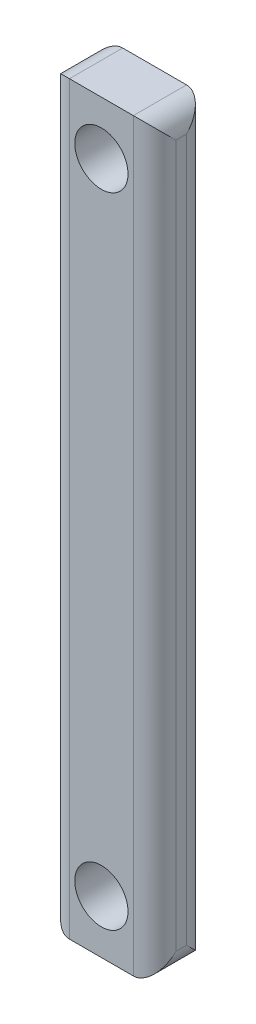
ISO-10303-21;
HEADER;
FILE_DESCRIPTION(('STEP AP214'),'2;1');
FILE_NAME('part.step','',(''),(''),'','','');
FILE_SCHEMA(('AUTOMOTIVE_DESIGN { 1 0 10303 214 1 1 1 1 }'));
ENDSEC;
DATA;
#1=APPLICATION_CONTEXT('core data for automotive mechanical design processes');
#2=APPLICATION_PROTOCOL_DEFINITION('international standard','automotive_design',2000,#1);
#3=PRODUCT_CONTEXT('',#1,'mechanical');
#4=PRODUCT('Part','Part','',(#3));
#5=PRODUCT_RELATED_PRODUCT_CATEGORY('part','',(#4));
#6=PRODUCT_DEFINITION_FORMATION('','',#4);
#7=PRODUCT_DEFINITION_CONTEXT('part definition',#1,'design');
#8=PRODUCT_DEFINITION('design','',#6,#7);
#9=PRODUCT_DEFINITION_SHAPE('','',#8);
#10=(LENGTH_UNIT() NAMED_UNIT(*) SI_UNIT(.MILLI.,.METRE.));
#11=(NAMED_UNIT(*) PLANE_ANGLE_UNIT() SI_UNIT($,.RADIAN.));
#12=(NAMED_UNIT(*) SI_UNIT($,.STERADIAN.) SOLID_ANGLE_UNIT());
#13=UNCERTAINTY_MEASURE_WITH_UNIT(LENGTH_MEASURE(1.E-05),#10,'distance_accuracy_value','');
#14=(GEOMETRIC_REPRESENTATION_CONTEXT(3) GLOBAL_UNCERTAINTY_ASSIGNED_CONTEXT((#13)) GLOBAL_UNIT_ASSIGNED_CONTEXT((#10,
#11,#12)) REPRESENTATION_CONTEXT('',''));
#15=CARTESIAN_POINT('',(0.,0.,0.));
#16=DIRECTION('',(0.,0.,1.));
#17=DIRECTION('',(1.,0.,0.));
#18=AXIS2_PLACEMENT_3D('',#15,#16,#17);
#19=CARTESIAN_POINT('',(0.,0.,25.));
#20=DIRECTION('',(0.,0.,1.));
#21=DIRECTION('',(1.,0.,0.));
#22=AXIS2_PLACEMENT_3D('',#19,#20,#21);
#23=PLANE('',#22);
#24=CARTESIAN_POINT('',(-25.,25.,25.));
#25=DIRECTION('',(0.,0.,1.));
#26=DIRECTION('',(1.,0.,0.));
#27=AXIS2_PLACEMENT_3D('',#24,#25,#26);
#28=CIRCLE('',#27,12.5);
#29=CARTESIAN_POINT('',(-12.5,25.,25.));
#30=VERTEX_POINT('',#29);
#31=EDGE_CURVE('E237',#30,#30,#28,.T.);
#32=ORIENTED_EDGE('',*,*,#31,.F.);
#33=EDGE_LOOP('',(#32));
#34=FACE_BOUND('',#33,.T.);
#35=DIRECTION('',(-1.,0.,0.));
#36=VECTOR('',#35,1.);
#37=CARTESIAN_POINT('',(0.,350.,25.));
#38=LINE('',#37,#36);
#39=CARTESIAN_POINT('',(-10.,350.,25.));
#40=VERTEX_POINT('',#39);
#41=CARTESIAN_POINT('',(-40.,350.,25.));
#42=VERTEX_POINT('',#41);
#43=EDGE_CURVE('E185',#40,#42,#38,.T.);
#44=ORIENTED_EDGE('',*,*,#43,.T.);
#45=DIRECTION('',(0.,-1.,0.));
#46=VECTOR('',#45,1.);
#47=CARTESIAN_POINT('',(-40.,0.,25.));
#48=LINE('',#47,#46);
#49=CARTESIAN_POINT('',(-40.,0.,25.));
#50=VERTEX_POINT('',#49);
#51=EDGE_CURVE('E56',#42,#50,#48,.T.);
#52=ORIENTED_EDGE('',*,*,#51,.T.);
#53=DIRECTION('',(1.,0.,0.));
#54=VECTOR('',#53,1.);
#55=CARTESIAN_POINT('',(0.,0.,25.));
#56=LINE('',#55,#54);
#57=CARTESIAN_POINT('',(-10.,0.,25.));
#58=VERTEX_POINT('',#57);
#59=EDGE_CURVE('E120',#50,#58,#56,.T.);
#60=ORIENTED_EDGE('',*,*,#59,.T.);
#61=DIRECTION('',(0.,1.,0.));
#62=VECTOR('',#61,1.);
#63=CARTESIAN_POINT('',(-10.,350.,25.));
#64=LINE('',#63,#62);
#65=EDGE_CURVE('E143',#58,#40,#64,.T.);
#66=ORIENTED_EDGE('',*,*,#65,.T.);
#67=EDGE_LOOP('',(#44,#52,#60,#66));
#68=FACE_BOUND('',#67,.T.);
#69=CARTESIAN_POINT('',(-25.,325.,25.));
#70=DIRECTION('',(0.,0.,1.));
#71=DIRECTION('',(1.,0.,0.));
#72=AXIS2_PLACEMENT_3D('',#69,#70,#71);
#73=CIRCLE('',#72,12.5);
#74=CARTESIAN_POINT('',(-12.5,325.,25.));
#75=VERTEX_POINT('',#74);
#76=EDGE_CURVE('E230',#75,#75,#73,.T.);
#77=ORIENTED_EDGE('',*,*,#76,.F.);
#78=EDGE_LOOP('',(#77));
#79=FACE_BOUND('',#78,.T.);
#80=ADVANCED_FACE('F32',(#34,#68,#79),#23,.T.);
#81=CARTESIAN_POINT('',(0.,0.,0.));
#82=DIRECTION('',(0.,0.,1.));
#83=DIRECTION('',(1.,0.,0.));
#84=AXIS2_PLACEMENT_3D('',#81,#82,#83);
#85=PLANE('',#84);
#86=CARTESIAN_POINT('',(-25.,25.,0.));
#87=DIRECTION('',(0.,0.,1.));
#88=DIRECTION('',(1.,0.,0.));
#89=AXIS2_PLACEMENT_3D('',#86,#87,#88);
#90=CIRCLE('',#89,12.5);
#91=CARTESIAN_POINT('',(-12.5,25.,0.));
#92=VERTEX_POINT('',#91);
#93=EDGE_CURVE('E234',#92,#92,#90,.T.);
#94=ORIENTED_EDGE('',*,*,#93,.T.);
#95=EDGE_LOOP('',(#94));
#96=FACE_BOUND('',#95,.T.);
#97=DIRECTION('',(-1.,0.,0.));
#98=VECTOR('',#97,1.);
#99=CARTESIAN_POINT('',(0.,350.,0.));
#100=LINE('',#99,#98);
#101=CARTESIAN_POINT('',(-10.,350.,0.));
#102=VERTEX_POINT('',#101);
#103=CARTESIAN_POINT('',(-40.,350.,0.));
#104=VERTEX_POINT('',#103);
#105=EDGE_CURVE('E186',#102,#104,#100,.T.);
#106=ORIENTED_EDGE('',*,*,#105,.F.);
#107=DIRECTION('',(0.,1.,0.));
#108=VECTOR('',#107,1.);
#109=CARTESIAN_POINT('',(-10.,0.,0.));
#110=LINE('',#109,#108);
#111=CARTESIAN_POINT('',(-10.,0.,0.));
#112=VERTEX_POINT('',#111);
#113=EDGE_CURVE('E107',#102,#112,#110,.F.);
#114=ORIENTED_EDGE('',*,*,#113,.T.);
#115=DIRECTION('',(1.,0.,0.));
#116=VECTOR('',#115,1.);
#117=CARTESIAN_POINT('',(0.,0.,0.));
#118=LINE('',#117,#116);
#119=CARTESIAN_POINT('',(-40.,0.,0.));
#120=VERTEX_POINT('',#119);
#121=EDGE_CURVE('E178',#120,#112,#118,.T.);
#122=ORIENTED_EDGE('',*,*,#121,.F.);
#123=DIRECTION('',(0.,-1.,0.));
#124=VECTOR('',#123,1.);
#125=CARTESIAN_POINT('',(-40.,0.,0.));
#126=LINE('',#125,#124);
#127=EDGE_CURVE('E127',#120,#104,#126,.F.);
#128=ORIENTED_EDGE('',*,*,#127,.T.);
#129=EDGE_LOOP('',(#106,#114,#122,#128));
#130=FACE_BOUND('',#129,.T.);
#131=CARTESIAN_POINT('',(-25.,325.,0.));
#132=DIRECTION('',(0.,0.,1.));
#133=DIRECTION('',(1.,0.,0.));
#134=AXIS2_PLACEMENT_3D('',#131,#132,#133);
#135=CIRCLE('',#134,12.5);
#136=CARTESIAN_POINT('',(-12.5,325.,0.));
#137=VERTEX_POINT('',#136);
#138=EDGE_CURVE('E155',#137,#137,#135,.T.);
#139=ORIENTED_EDGE('',*,*,#138,.T.);
#140=EDGE_LOOP('',(#139));
#141=FACE_BOUND('',#140,.T.);
#142=ADVANCED_FACE('F182',(#96,#130,#141),#85,.F.);
#143=CARTESIAN_POINT('',(0.,0.,25.));
#144=DIRECTION('',(-1.,0.,0.));
#145=DIRECTION('',(0.,0.,1.));
#146=AXIS2_PLACEMENT_3D('',#143,#144,#145);
#147=PLANE('',#146);
#148=DIRECTION('',(0.,1.,0.));
#149=VECTOR('',#148,1.);
#150=CARTESIAN_POINT('',(0.,0.,15.));
#151=LINE('',#150,#149);
#152=CARTESIAN_POINT('',(0.,340.,15.));
#153=VERTEX_POINT('',#152);
#154=CARTESIAN_POINT('',(0.,10.,15.));
#155=VERTEX_POINT('',#154);
#156=EDGE_CURVE('E119',#153,#155,#151,.F.);
#157=ORIENTED_EDGE('',*,*,#156,.T.);
#158=DIRECTION('',(0.,0.,-1.));
#159=VECTOR('',#158,1.);
#160=CARTESIAN_POINT('',(0.,10.,25.));
#161=LINE('',#160,#159);
#162=CARTESIAN_POINT('',(0.,10.,10.));
#163=VERTEX_POINT('',#162);
#164=EDGE_CURVE('E124',#155,#163,#161,.T.);
#165=ORIENTED_EDGE('',*,*,#164,.T.);
#166=DIRECTION('',(0.,1.,0.));
#167=VECTOR('',#166,1.);
#168=CARTESIAN_POINT('',(0.,0.,10.));
#169=LINE('',#168,#167);
#170=CARTESIAN_POINT('',(0.,340.,10.));
#171=VERTEX_POINT('',#170);
#172=EDGE_CURVE('E105',#163,#171,#169,.T.);
#173=ORIENTED_EDGE('',*,*,#172,.T.);
#174=DIRECTION('',(0.,0.,-1.));
#175=VECTOR('',#174,1.);
#176=CARTESIAN_POINT('',(0.,340.,25.));
#177=LINE('',#176,#175);
#178=EDGE_CURVE('E113',#171,#153,#177,.F.);
#179=ORIENTED_EDGE('',*,*,#178,.T.);
#180=EDGE_LOOP('',(#157,#165,#173,#179));
#181=FACE_BOUND('',#180,.T.);
#182=ADVANCED_FACE('F122',(#181),#147,.F.);
#183=CARTESIAN_POINT('',(0.,350.,25.));
#184=DIRECTION('',(0.,-1.,0.));
#185=DIRECTION('',(0.,0.,-1.));
#186=AXIS2_PLACEMENT_3D('',#183,#184,#185);
#187=PLANE('',#186);
#188=ORIENTED_EDGE('',*,*,#43,.F.);
#189=DIRECTION('',(0.,0.,-1.));
#190=VECTOR('',#189,1.);
#191=CARTESIAN_POINT('',(-10.,350.,25.));
#192=LINE('',#191,#190);
#193=EDGE_CURVE('E11',#40,#102,#192,.T.);
#194=ORIENTED_EDGE('',*,*,#193,.T.);
#195=ORIENTED_EDGE('',*,*,#105,.T.);
#196=DIRECTION('',(0.,0.,-1.));
#197=VECTOR('',#196,1.);
#198=CARTESIAN_POINT('',(-40.,350.,25.));
#199=LINE('',#198,#197);
#200=EDGE_CURVE('E41',#104,#42,#199,.F.);
#201=ORIENTED_EDGE('',*,*,#200,.T.);
#202=EDGE_LOOP('',(#188,#194,#195,#201));
#203=FACE_BOUND('',#202,.T.);
#204=ADVANCED_FACE('F194',(#203),#187,.F.);
#205=CARTESIAN_POINT('',(-50.,0.,25.));
#206=DIRECTION('',(1.,0.,0.));
#207=DIRECTION('',(0.,0.,-1.));
#208=AXIS2_PLACEMENT_3D('',#205,#206,#207);
#209=PLANE('',#208);
#210=DIRECTION('',(0.,-1.,0.));
#211=VECTOR('',#210,1.);
#212=CARTESIAN_POINT('',(-50.,0.,10.));
#213=LINE('',#212,#211);
#214=CARTESIAN_POINT('',(-50.,340.,10.));
#215=VERTEX_POINT('',#214);
#216=CARTESIAN_POINT('',(-50.,9.99999999999999,10.));
#217=VERTEX_POINT('',#216);
#218=EDGE_CURVE('E138',#215,#217,#213,.T.);
#219=ORIENTED_EDGE('',*,*,#218,.T.);
#220=DIRECTION('',(0.,0.,-1.));
#221=VECTOR('',#220,1.);
#222=CARTESIAN_POINT('',(-50.,9.99999999999999,25.));
#223=LINE('',#222,#221);
#224=CARTESIAN_POINT('',(-50.,9.99999999999999,15.));
#225=VERTEX_POINT('',#224);
#226=EDGE_CURVE('E141',#217,#225,#223,.F.);
#227=ORIENTED_EDGE('',*,*,#226,.T.);
#228=DIRECTION('',(0.,-1.,0.));
#229=VECTOR('',#228,1.);
#230=CARTESIAN_POINT('',(-50.,350.,15.));
#231=LINE('',#230,#229);
#232=CARTESIAN_POINT('',(-50.,340.,15.));
#233=VERTEX_POINT('',#232);
#234=EDGE_CURVE('E136',#225,#233,#231,.F.);
#235=ORIENTED_EDGE('',*,*,#234,.T.);
#236=DIRECTION('',(0.,0.,-1.));
#237=VECTOR('',#236,1.);
#238=CARTESIAN_POINT('',(-50.,340.,25.));
#239=LINE('',#238,#237);
#240=EDGE_CURVE('E134',#233,#215,#239,.T.);
#241=ORIENTED_EDGE('',*,*,#240,.T.);
#242=EDGE_LOOP('',(#219,#227,#235,#241));
#243=FACE_BOUND('',#242,.T.);
#244=ADVANCED_FACE('F192',(#243),#209,.F.);
#245=CARTESIAN_POINT('',(0.,0.,25.));
#246=DIRECTION('',(0.,1.,0.));
#247=DIRECTION('',(-1.,0.,0.));
#248=AXIS2_PLACEMENT_3D('',#245,#246,#247);
#249=PLANE('',#248);
#250=ORIENTED_EDGE('',*,*,#121,.T.);
#251=DIRECTION('',(0.,0.,-1.));
#252=VECTOR('',#251,1.);
#253=CARTESIAN_POINT('',(-10.,0.,25.));
#254=LINE('',#253,#252);
#255=EDGE_CURVE('E49',#112,#58,#254,.F.);
#256=ORIENTED_EDGE('',*,*,#255,.T.);
#257=ORIENTED_EDGE('',*,*,#59,.F.);
#258=DIRECTION('',(0.,0.,-1.));
#259=VECTOR('',#258,1.);
#260=CARTESIAN_POINT('',(-40.,0.,25.));
#261=LINE('',#260,#259);
#262=EDGE_CURVE('E146',#50,#120,#261,.T.);
#263=ORIENTED_EDGE('',*,*,#262,.T.);
#264=EDGE_LOOP('',(#250,#256,#257,#263));
#265=FACE_BOUND('',#264,.T.);
#266=ADVANCED_FACE('F177',(#265),#249,.F.);
#267=CARTESIAN_POINT('',(-25.,25.,25.));
#268=DIRECTION('',(0.,0.,-1.));
#269=DIRECTION('',(-1.,0.,0.));
#270=AXIS2_PLACEMENT_3D('',#267,#268,#269);
#271=CYLINDRICAL_SURFACE('',#270,12.5);
#272=ORIENTED_EDGE('',*,*,#31,.T.);
#273=EDGE_LOOP('',(#272));
#274=FACE_BOUND('',#273,.T.);
#275=ORIENTED_EDGE('',*,*,#93,.F.);
#276=EDGE_LOOP('',(#275));
#277=FACE_BOUND('',#276,.T.);
#278=ADVANCED_FACE('F200',(#274,#277),#271,.F.);
#279=CARTESIAN_POINT('',(-25.,325.,25.));
#280=DIRECTION('',(0.,0.,-1.));
#281=DIRECTION('',(-1.,0.,0.));
#282=AXIS2_PLACEMENT_3D('',#279,#280,#281);
#283=CYLINDRICAL_SURFACE('',#282,12.5);
#284=ORIENTED_EDGE('',*,*,#76,.T.);
#285=EDGE_LOOP('',(#284));
#286=FACE_BOUND('',#285,.T.);
#287=ORIENTED_EDGE('',*,*,#138,.F.);
#288=EDGE_LOOP('',(#287));
#289=FACE_BOUND('',#288,.T.);
#290=ADVANCED_FACE('F216',(#286,#289),#283,.F.);
#291=CARTESIAN_POINT('',(-10.,0.,15.));
#292=DIRECTION('',(0.,-1.,0.));
#293=DIRECTION('',(0.,0.,-1.));
#294=AXIS2_PLACEMENT_3D('',#291,#292,#293);
#295=CYLINDRICAL_SURFACE('',#294,10.);
#296=CARTESIAN_POINT('',(-10.,340.,15.));
#297=DIRECTION('',(0.,0.707106781186547,-0.707106781186547));
#298=DIRECTION('',(0.,-0.707106781186547,-0.707106781186547));
#299=AXIS2_PLACEMENT_3D('',#296,#297,#298);
#300=ELLIPSE('',#299,14.1421356237309,10.);
#301=EDGE_CURVE('E116',#40,#153,#300,.T.);
#302=ORIENTED_EDGE('',*,*,#301,.F.);
#303=ORIENTED_EDGE('',*,*,#65,.F.);
#304=CARTESIAN_POINT('',(-10.,10.,15.));
#305=DIRECTION('',(0.,-0.707106781186547,-0.707106781186547));
#306=DIRECTION('',(0.,0.707106781186547,-0.707106781186547));
#307=AXIS2_PLACEMENT_3D('',#304,#305,#306);
#308=ELLIPSE('',#307,14.1421356237309,10.);
#309=EDGE_CURVE('E152',#155,#58,#308,.T.);
#310=ORIENTED_EDGE('',*,*,#309,.F.);
#311=ORIENTED_EDGE('',*,*,#156,.F.);
#312=EDGE_LOOP('',(#302,#303,#310,#311));
#313=FACE_BOUND('',#312,.T.);
#314=ADVANCED_FACE('F219',(#313),#295,.T.);
#315=CARTESIAN_POINT('',(-10.,10.,25.));
#316=DIRECTION('',(0.,0.,-1.));
#317=DIRECTION('',(-1.,0.,0.));
#318=AXIS2_PLACEMENT_3D('',#315,#316,#317);
#319=CYLINDRICAL_SURFACE('',#318,10.);
#320=ORIENTED_EDGE('',*,*,#309,.T.);
#321=ORIENTED_EDGE('',*,*,#255,.F.);
#322=CARTESIAN_POINT('',(-10.,10.,10.));
#323=DIRECTION('',(0.,0.707106781186547,-0.707106781186547));
#324=DIRECTION('',(0.,-0.707106781186547,-0.707106781186547));
#325=AXIS2_PLACEMENT_3D('',#322,#323,#324);
#326=ELLIPSE('',#325,14.1421356237309,10.);
#327=EDGE_CURVE('E110',#163,#112,#326,.T.);
#328=ORIENTED_EDGE('',*,*,#327,.F.);
#329=ORIENTED_EDGE('',*,*,#164,.F.);
#330=EDGE_LOOP('',(#320,#321,#328,#329));
#331=FACE_BOUND('',#330,.T.);
#332=ADVANCED_FACE('F224',(#331),#319,.T.);
#333=CARTESIAN_POINT('',(-10.,340.,25.));
#334=DIRECTION('',(0.,0.,-1.));
#335=DIRECTION('',(-1.,0.,0.));
#336=AXIS2_PLACEMENT_3D('',#333,#334,#335);
#337=CYLINDRICAL_SURFACE('',#336,10.);
#338=ORIENTED_EDGE('',*,*,#301,.T.);
#339=ORIENTED_EDGE('',*,*,#178,.F.);
#340=CARTESIAN_POINT('',(-10.,340.,10.));
#341=DIRECTION('',(0.,-0.707106781186547,-0.707106781186547));
#342=DIRECTION('',(0.,0.707106781186547,-0.707106781186547));
#343=AXIS2_PLACEMENT_3D('',#340,#341,#342);
#344=ELLIPSE('',#343,14.1421356237309,10.);
#345=EDGE_CURVE('E101',#102,#171,#344,.T.);
#346=ORIENTED_EDGE('',*,*,#345,.F.);
#347=ORIENTED_EDGE('',*,*,#193,.F.);
#348=EDGE_LOOP('',(#338,#339,#346,#347));
#349=FACE_BOUND('',#348,.T.);
#350=ADVANCED_FACE('F114',(#349),#337,.T.);
#351=CARTESIAN_POINT('',(-10.,0.,10.));
#352=DIRECTION('',(0.,1.,0.));
#353=DIRECTION('',(0.,0.,1.));
#354=AXIS2_PLACEMENT_3D('',#351,#352,#353);
#355=CYLINDRICAL_SURFACE('',#354,10.);
#356=ORIENTED_EDGE('',*,*,#327,.T.);
#357=ORIENTED_EDGE('',*,*,#113,.F.);
#358=ORIENTED_EDGE('',*,*,#345,.T.);
#359=ORIENTED_EDGE('',*,*,#172,.F.);
#360=EDGE_LOOP('',(#356,#357,#358,#359));
#361=FACE_BOUND('',#360,.T.);
#362=ADVANCED_FACE('F103',(#361),#355,.T.);
#363=CARTESIAN_POINT('',(-40.,0.,15.));
#364=DIRECTION('',(0.,1.,0.));
#365=DIRECTION('',(0.,0.,1.));
#366=AXIS2_PLACEMENT_3D('',#363,#364,#365);
#367=CYLINDRICAL_SURFACE('',#366,10.);
#368=CARTESIAN_POINT('',(-40.,9.99999999999999,15.));
#369=DIRECTION('',(0.,-0.707106781186547,-0.707106781186547));
#370=DIRECTION('',(0.,0.707106781186547,-0.707106781186547));
#371=AXIS2_PLACEMENT_3D('',#368,#369,#370);
#372=ELLIPSE('',#371,14.1421356237309,10.);
#373=EDGE_CURVE('E159',#50,#225,#372,.T.);
#374=ORIENTED_EDGE('',*,*,#373,.F.);
#375=ORIENTED_EDGE('',*,*,#51,.F.);
#376=CARTESIAN_POINT('',(-40.,340.,15.));
#377=DIRECTION('',(0.,0.707106781186547,-0.707106781186547));
#378=DIRECTION('',(0.,-0.707106781186547,-0.707106781186547));
#379=AXIS2_PLACEMENT_3D('',#376,#377,#378);
#380=ELLIPSE('',#379,14.1421356237309,10.);
#381=EDGE_CURVE('E36',#233,#42,#380,.T.);
#382=ORIENTED_EDGE('',*,*,#381,.F.);
#383=ORIENTED_EDGE('',*,*,#234,.F.);
#384=EDGE_LOOP('',(#374,#375,#382,#383));
#385=FACE_BOUND('',#384,.T.);
#386=ADVANCED_FACE('F34',(#385),#367,.T.);
#387=CARTESIAN_POINT('',(-40.,340.,25.));
#388=DIRECTION('',(0.,0.,-1.));
#389=DIRECTION('',(-1.,0.,0.));
#390=AXIS2_PLACEMENT_3D('',#387,#388,#389);
#391=CYLINDRICAL_SURFACE('',#390,10.);
#392=ORIENTED_EDGE('',*,*,#381,.T.);
#393=ORIENTED_EDGE('',*,*,#200,.F.);
#394=CARTESIAN_POINT('',(-40.,340.,10.));
#395=DIRECTION('',(0.,-0.707106781186547,-0.707106781186547));
#396=DIRECTION('',(0.,0.707106781186547,-0.707106781186547));
#397=AXIS2_PLACEMENT_3D('',#394,#395,#396);
#398=ELLIPSE('',#397,14.1421356237309,10.);
#399=EDGE_CURVE('E158',#215,#104,#398,.T.);
#400=ORIENTED_EDGE('',*,*,#399,.F.);
#401=ORIENTED_EDGE('',*,*,#240,.F.);
#402=EDGE_LOOP('',(#392,#393,#400,#401));
#403=FACE_BOUND('',#402,.T.);
#404=ADVANCED_FACE('F170',(#403),#391,.T.);
#405=CARTESIAN_POINT('',(-40.,9.99999999999999,25.));
#406=DIRECTION('',(0.,0.,-1.));
#407=DIRECTION('',(-1.,0.,0.));
#408=AXIS2_PLACEMENT_3D('',#405,#406,#407);
#409=CYLINDRICAL_SURFACE('',#408,10.);
#410=ORIENTED_EDGE('',*,*,#373,.T.);
#411=ORIENTED_EDGE('',*,*,#226,.F.);
#412=CARTESIAN_POINT('',(-40.,9.99999999999999,10.));
#413=DIRECTION('',(0.,0.707106781186547,-0.707106781186547));
#414=DIRECTION('',(0.,-0.707106781186547,-0.707106781186547));
#415=AXIS2_PLACEMENT_3D('',#412,#413,#414);
#416=ELLIPSE('',#415,14.1421356237309,10.);
#417=EDGE_CURVE('E156',#120,#217,#416,.T.);
#418=ORIENTED_EDGE('',*,*,#417,.F.);
#419=ORIENTED_EDGE('',*,*,#262,.F.);
#420=EDGE_LOOP('',(#410,#411,#418,#419));
#421=FACE_BOUND('',#420,.T.);
#422=ADVANCED_FACE('F175',(#421),#409,.T.);
#423=CARTESIAN_POINT('',(-40.,0.,10.));
#424=DIRECTION('',(0.,-1.,0.));
#425=DIRECTION('',(0.,0.,-1.));
#426=AXIS2_PLACEMENT_3D('',#423,#424,#425);
#427=CYLINDRICAL_SURFACE('',#426,10.);
#428=ORIENTED_EDGE('',*,*,#399,.T.);
#429=ORIENTED_EDGE('',*,*,#127,.F.);
#430=ORIENTED_EDGE('',*,*,#417,.T.);
#431=ORIENTED_EDGE('',*,*,#218,.F.);
#432=EDGE_LOOP('',(#428,#429,#430,#431));
#433=FACE_BOUND('',#432,.T.);
#434=ADVANCED_FACE('F189',(#433),#427,.T.);
#435=CLOSED_SHELL('',(#80,#142,#182,#204,#244,#266,#278,#290,#314,#332,#350,#362,#386,#404,#422,#434));
#436=MANIFOLD_SOLID_BREP('B2',#435);
#437=ADVANCED_BREP_SHAPE_REPRESENTATION('',(#18,#436),#14);
#438=SHAPE_DEFINITION_REPRESENTATION(#9,#437);
ENDSEC;
END-ISO-10303-21;
